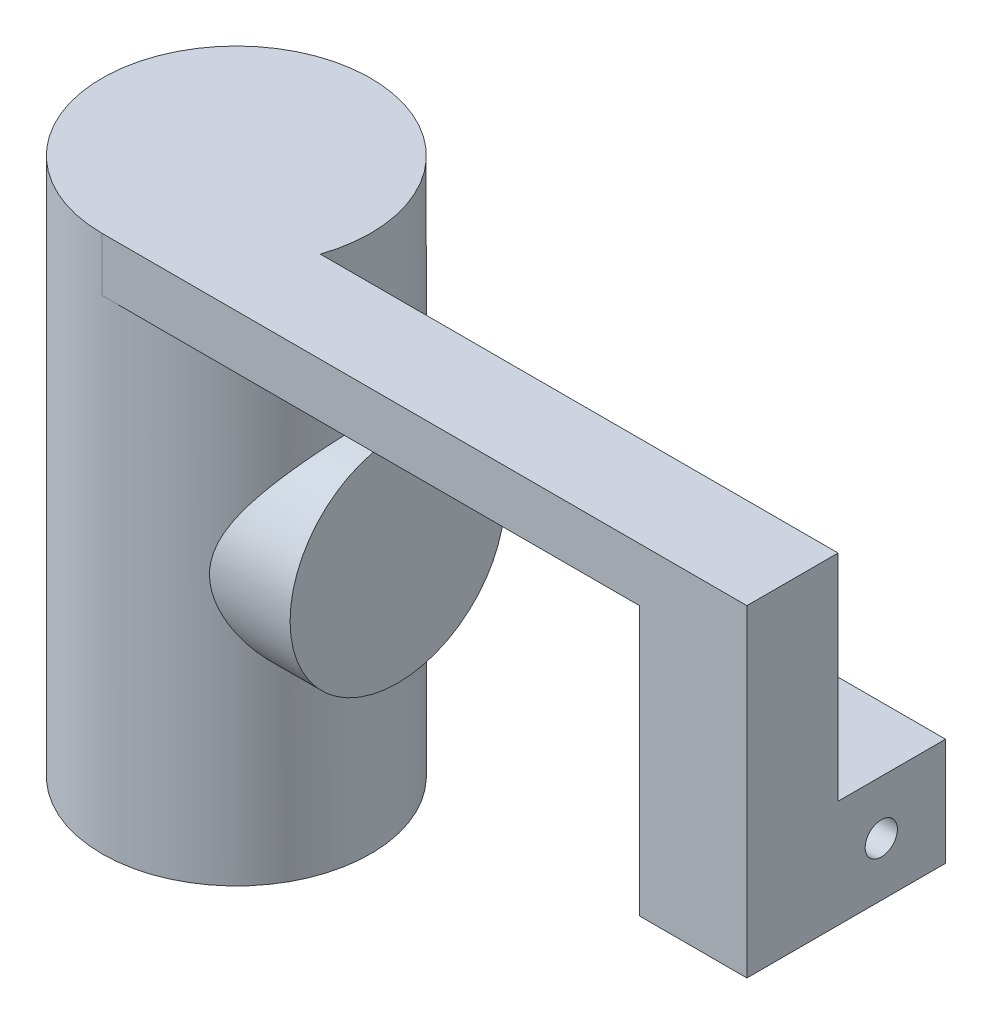
ISO-10303-21;
HEADER;
FILE_DESCRIPTION(('STEP AP214'),'2;1');
FILE_NAME('part.step','',(''),(''),'','','');
FILE_SCHEMA(('AUTOMOTIVE_DESIGN { 1 0 10303 214 1 1 1 1 }'));
ENDSEC;
DATA;
#1=APPLICATION_CONTEXT('core data for automotive mechanical design processes');
#2=APPLICATION_PROTOCOL_DEFINITION('international standard','automotive_design',2000,#1);
#3=PRODUCT_CONTEXT('',#1,'mechanical');
#4=PRODUCT('Part','Part','',(#3));
#5=PRODUCT_RELATED_PRODUCT_CATEGORY('part','',(#4));
#6=PRODUCT_DEFINITION_FORMATION('','',#4);
#7=PRODUCT_DEFINITION_CONTEXT('part definition',#1,'design');
#8=PRODUCT_DEFINITION('design','',#6,#7);
#9=PRODUCT_DEFINITION_SHAPE('','',#8);
#10=(LENGTH_UNIT() NAMED_UNIT(*) SI_UNIT(.MILLI.,.METRE.));
#11=(NAMED_UNIT(*) PLANE_ANGLE_UNIT() SI_UNIT($,.RADIAN.));
#12=(NAMED_UNIT(*) SI_UNIT($,.STERADIAN.) SOLID_ANGLE_UNIT());
#13=UNCERTAINTY_MEASURE_WITH_UNIT(LENGTH_MEASURE(1.E-05),#10,'distance_accuracy_value','');
#14=(GEOMETRIC_REPRESENTATION_CONTEXT(3) GLOBAL_UNCERTAINTY_ASSIGNED_CONTEXT((#13)) GLOBAL_UNIT_ASSIGNED_CONTEXT((#10,
#11,#12)) REPRESENTATION_CONTEXT('',''));
#15=CARTESIAN_POINT('',(0.,0.,0.));
#16=DIRECTION('',(0.,0.,1.));
#17=DIRECTION('',(1.,0.,0.));
#18=AXIS2_PLACEMENT_3D('',#15,#16,#17);
#19=CARTESIAN_POINT('',(229.689354239155,50.,8.039142994679));
#20=DIRECTION('',(0.,0.,1.));
#21=DIRECTION('',(0.,-1.,0.));
#22=AXIS2_PLACEMENT_3D('',#19,#20,#21);
#23=PLANE('',#22);
#24=DIRECTION('',(1.,0.,0.));
#25=VECTOR('',#24,1.);
#26=CARTESIAN_POINT('',(100.,10.,8.039142994679));
#27=LINE('',#26,#25);
#28=CARTESIAN_POINT('',(100.,10.,8.039142994679));
#29=VERTEX_POINT('',#28);
#30=CARTESIAN_POINT('',(120.,10.,8.039142994679));
#31=VERTEX_POINT('',#30);
#32=EDGE_CURVE('E130',#29,#31,#27,.T.);
#33=ORIENTED_EDGE('',*,*,#32,.F.);
#34=DIRECTION('',(0.,1.,0.));
#35=VECTOR('',#34,1.);
#36=CARTESIAN_POINT('',(100.,-10.,8.039142994679));
#37=LINE('',#36,#35);
#38=CARTESIAN_POINT('',(100.,40.,8.039142994679));
#39=VERTEX_POINT('',#38);
#40=EDGE_CURVE('E135',#29,#39,#37,.T.);
#41=ORIENTED_EDGE('',*,*,#40,.T.);
#42=DIRECTION('',(-1.,0.,0.));
#43=VECTOR('',#42,1.);
#44=CARTESIAN_POINT('',(229.689354239155,40.,8.039142994679));
#45=LINE('',#44,#43);
#46=CARTESIAN_POINT('',(23.6721815621439,40.,8.039142994679));
#47=VERTEX_POINT('',#46);
#48=EDGE_CURVE('E58',#39,#47,#45,.T.);
#49=ORIENTED_EDGE('',*,*,#48,.T.);
#50=DIRECTION('',(0.,-1.,0.));
#51=VECTOR('',#50,1.);
#52=CARTESIAN_POINT('',(23.6721815621439,50.,8.039142994679));
#53=LINE('',#52,#51);
#54=CARTESIAN_POINT('',(23.6721815621439,50.,8.039142994679));
#55=VERTEX_POINT('',#54);
#56=EDGE_CURVE('E169',#47,#55,#53,.F.);
#57=ORIENTED_EDGE('',*,*,#56,.T.);
#58=DIRECTION('',(-1.,0.,0.));
#59=VECTOR('',#58,1.);
#60=CARTESIAN_POINT('',(229.689354239155,50.,8.039142994679));
#61=LINE('',#60,#59);
#62=CARTESIAN_POINT('',(120.,50.,8.039142994679));
#63=VERTEX_POINT('',#62);
#64=EDGE_CURVE('E177',#63,#55,#61,.T.);
#65=ORIENTED_EDGE('',*,*,#64,.F.);
#66=DIRECTION('',(0.,1.,0.));
#67=VECTOR('',#66,1.);
#68=CARTESIAN_POINT('',(120.,50.,8.039142994679));
#69=LINE('',#68,#67);
#70=EDGE_CURVE('E166',#31,#63,#69,.T.);
#71=ORIENTED_EDGE('',*,*,#70,.F.);
#72=EDGE_LOOP('',(#33,#41,#49,#57,#65,#71));
#73=FACE_BOUND('',#72,.T.);
#74=ADVANCED_FACE('F41',(#73),#23,.F.);
#75=CARTESIAN_POINT('',(229.689354239155,40.,25.));
#76=DIRECTION('',(0.,1.,0.));
#77=DIRECTION('',(0.,0.,1.));
#78=AXIS2_PLACEMENT_3D('',#75,#76,#77);
#79=PLANE('',#78);
#80=DIRECTION('',(0.,0.,-1.));
#81=VECTOR('',#80,1.);
#82=CARTESIAN_POINT('',(100.,40.,25.));
#83=LINE('',#82,#81);
#84=CARTESIAN_POINT('',(100.,40.,25.));
#85=VERTEX_POINT('',#84);
#86=EDGE_CURVE('E137',#85,#39,#83,.T.);
#87=ORIENTED_EDGE('',*,*,#86,.F.);
#88=DIRECTION('',(-1.,0.,0.));
#89=VECTOR('',#88,1.);
#90=CARTESIAN_POINT('',(229.689354239155,40.,25.));
#91=LINE('',#90,#89);
#92=CARTESIAN_POINT('',(0.,40.,25.));
#93=VERTEX_POINT('',#92);
#94=EDGE_CURVE('E165',#85,#93,#91,.T.);
#95=ORIENTED_EDGE('',*,*,#94,.T.);
#96=CARTESIAN_POINT('',(0.,40.,0.));
#97=DIRECTION('',(0.,1.,0.));
#98=DIRECTION('',(0.,0.,1.));
#99=AXIS2_PLACEMENT_3D('',#96,#97,#98);
#100=CIRCLE('',#99,25.);
#101=EDGE_CURVE('E12',#93,#47,#100,.T.);
#102=ORIENTED_EDGE('',*,*,#101,.T.);
#103=ORIENTED_EDGE('',*,*,#48,.F.);
#104=EDGE_LOOP('',(#87,#95,#102,#103));
#105=FACE_BOUND('',#104,.T.);
#106=ADVANCED_FACE('F223',(#105),#79,.F.);
#107=CARTESIAN_POINT('',(0.,50.,0.));
#108=DIRECTION('',(0.,-1.,0.));
#109=DIRECTION('',(0.,0.,-1.));
#110=AXIS2_PLACEMENT_3D('',#107,#108,#109);
#111=CYLINDRICAL_SURFACE('',#110,25.);
#112=CARTESIAN_POINT('',(15.,0.,20.));
#113=CARTESIAN_POINT('',(15.0000088736725,-0.375561365561585,19.9999962926173));
#114=CARTESIAN_POINT('',(15.0141750346591,-0.751259573291653,19.9893930046637));
#115=CARTESIAN_POINT('',(15.070142772738,-1.49955766359186,19.9472295614098));
#116=CARTESIAN_POINT('',(15.1119631943118,-1.87215525787202,19.9156551156393));
#117=CARTESIAN_POINT('',(15.2213478980294,-2.61223578611677,19.8321780083143));
#118=CARTESIAN_POINT('',(15.2889813033108,-2.97970221671656,19.7802207542779));
#119=CARTESIAN_POINT('',(15.4470727059971,-3.70647875847824,19.6570076475307));
#120=CARTESIAN_POINT('',(15.5375387662973,-4.06578593940734,19.5857449768447));
#121=CARTESIAN_POINT('',(15.7052830755086,-4.65924234796872,19.4512611935685));
#122=CARTESIAN_POINT('',(15.777264008289,-4.89604979318361,19.3929770863774));
#123=CARTESIAN_POINT('',(15.9290175269818,-5.36495838353939,19.2685245813802));
#124=CARTESIAN_POINT('',(16.008787864795,-5.59706086336365,19.2023584571969));
#125=CARTESIAN_POINT('',(16.2583874663851,-6.28639950755564,18.9924204482248));
#126=CARTESIAN_POINT('',(16.438461109604,-6.7365147814177,18.837243748835));
#127=CARTESIAN_POINT('',(16.8189383053475,-7.61808786661511,18.4983342499176));
#128=CARTESIAN_POINT('',(17.0193868879852,-8.04950120855747,18.3145377001011));
#129=CARTESIAN_POINT('',(17.4341293267654,-8.89289471182062,17.9201862603243));
#130=CARTESIAN_POINT('',(17.6484228314515,-9.30487536598581,17.7096320494823));
#131=CARTESIAN_POINT('',(18.1648305832741,-10.2553974120961,17.1819650319468));
#132=CARTESIAN_POINT('',(18.4706788691686,-10.7858294871581,16.8538529821223));
#133=CARTESIAN_POINT('',(19.0880028760279,-11.8118379642277,16.1513803264203));
#134=CARTESIAN_POINT('',(19.3994805823717,-12.3074017550521,15.7770031209023));
#135=CARTESIAN_POINT('',(20.0190040941794,-13.2624424849901,14.9830857260937));
#136=CARTESIAN_POINT('',(20.327052455025,-13.7219480872222,14.5635820504617));
#137=CARTESIAN_POINT('',(20.9321249221037,-14.6033006830766,13.6796522230808));
#138=CARTESIAN_POINT('',(21.2291526745127,-15.025160198026,13.2152411157172));
#139=CARTESIAN_POINT('',(21.748027106478,-15.7488727978038,12.3381233033674));
#140=CARTESIAN_POINT('',(21.9731384202275,-16.0579745515095,11.9333126892403));
#141=CARTESIAN_POINT('',(22.4078243876689,-16.6478331858641,11.0955852490369));
#142=CARTESIAN_POINT('',(22.6173997412604,-16.9285913436069,10.6626696907469));
#143=CARTESIAN_POINT('',(23.0169572465042,-17.4588269628689,9.77028072461787));
#144=CARTESIAN_POINT('',(23.2069637984017,-17.708343465351,9.310841533003));
#145=CARTESIAN_POINT('',(23.5638648098979,-18.1735518121657,8.36653359290353));
#146=CARTESIAN_POINT('',(23.7307631030067,-18.3892492676466,7.88166908075929));
#147=CARTESIAN_POINT('',(24.0129006885665,-18.7518040690791,6.96924325820464));
#148=CARTESIAN_POINT('',(24.132129407249,-18.9041530577568,6.54509212186977));
#149=CARTESIAN_POINT('',(24.3496617753786,-19.1810681740325,5.68257829158782));
#150=CARTESIAN_POINT('',(24.4479675644109,-19.305637142486,5.24421705605759));
#151=CARTESIAN_POINT('',(24.6217593056216,-19.5252538478018,4.3558821644556));
#152=CARTESIAN_POINT('',(24.697253945882,-19.6203128245134,3.90591300054797));
#153=CARTESIAN_POINT('',(24.8239328453673,-19.7795341449066,2.99713406477301));
#154=CARTESIAN_POINT('',(24.875116814311,-19.8436961196631,2.53832418741135));
#155=CARTESIAN_POINT('',(24.9521996672002,-19.9402386753894,1.61360726200759));
#156=CARTESIAN_POINT('',(24.9780091489872,-19.9725068868928,1.1476809523183));
#157=CARTESIAN_POINT('',(25.0034458784075,-20.0043094777888,0.213992042391241));
#158=CARTESIAN_POINT('',(25.0030730756769,-20.0038437942145,-0.253770561377071));
#159=CARTESIAN_POINT('',(24.9761538060095,-19.9701867716747,-1.18736799204042));
#160=CARTESIAN_POINT('',(24.9496064528335,-19.9369943246195,-1.65320275312468));
#161=CARTESIAN_POINT('',(24.8709347186019,-19.8384544172188,-2.57925249006266));
#162=CARTESIAN_POINT('',(24.8188109274667,-19.7731076985111,-3.03946759528277));
#163=CARTESIAN_POINT('',(24.6936449338048,-19.6157650157554,-3.92597136214756));
#164=CARTESIAN_POINT('',(24.6219015200442,-19.5254205018148,-4.35273966221057));
#165=CARTESIAN_POINT('',(24.4579006470034,-19.3182016356292,-5.19571671792422));
#166=CARTESIAN_POINT('',(24.3656441088654,-19.2013284746489,-5.61192594679553));
#167=CARTESIAN_POINT('',(24.1621838322245,-18.9424794722292,-6.43174107520527));
#168=CARTESIAN_POINT('',(24.0509776242432,-18.8005003589476,-6.83534532396913));
#169=CARTESIAN_POINT('',(23.8113816719206,-18.4930035981065,-7.62821449404832));
#170=CARTESIAN_POINT('',(23.6829909080916,-18.3274845539852,-8.01747856287235));
#171=CARTESIAN_POINT('',(23.3977812813461,-17.9574879426194,-8.81708135492414));
#172=CARTESIAN_POINT('',(23.2394155993336,-17.7507939301222,-9.22584184459561));
#173=CARTESIAN_POINT('',(22.906772368539,-17.3130145334012,-10.0232967345393));
#174=CARTESIAN_POINT('',(22.7324939744453,-17.0819278532935,-10.4119900670894));
#175=CARTESIAN_POINT('',(22.3704779605334,-16.5971172246319,-11.1686012750122));
#176=CARTESIAN_POINT('',(22.1827357392803,-16.3433855295415,-11.5365119701174));
#177=CARTESIAN_POINT('',(21.7963253746775,-15.8149386877666,-12.2509255452122));
#178=CARTESIAN_POINT('',(21.5976557576735,-15.5402207089469,-12.5974255243352));
#179=CARTESIAN_POINT('',(21.1500639982279,-14.9125174759115,-13.3378586904546));
#180=CARTESIAN_POINT('',(20.8992219334084,-14.5550685913468,-13.7268549610686));
#181=CARTESIAN_POINT('',(20.3896591476269,-13.8134297991933,-14.4729375752678));
#182=CARTESIAN_POINT('',(20.1309371335264,-13.4292354891031,-14.8300186431678));
#183=CARTESIAN_POINT('',(19.6099503005857,-12.6348803465673,-15.5123917113823));
#184=CARTESIAN_POINT('',(19.3476817054736,-12.2246897841468,-15.8376461922545));
#185=CARTESIAN_POINT('',(18.8249798408101,-11.3793795574921,-16.4555095922113));
#186=CARTESIAN_POINT('',(18.5645463549802,-10.9442628880631,-16.7481224207045));
#187=CARTESIAN_POINT('',(18.0760476169757,-10.0922382908298,-17.2734617260135));
#188=CARTESIAN_POINT('',(17.8472812713524,-9.67761490271183,-17.5092418134772));
#189=CARTESIAN_POINT('',(17.4010467415081,-8.82764455668295,-17.9527853755262));
#190=CARTESIAN_POINT('',(17.1835798514243,-8.39229523590542,-18.1605456453044));
#191=CARTESIAN_POINT('',(16.766490943437,-7.50132950291147,-18.5463023979791));
#192=CARTESIAN_POINT('',(16.5668389427307,-7.04574915271813,-18.7243493460744));
#193=CARTESIAN_POINT('',(16.1924320055337,-6.11365179288613,-19.0490562055205));
#194=CARTESIAN_POINT('',(16.0176656946503,-5.63714447939481,-19.1957304717373));
#195=CARTESIAN_POINT('',(15.7494779227909,-4.81134027770838,-19.4158267954433));
#196=CARTESIAN_POINT('',(15.6474408209615,-4.46715880626483,-19.4979866901541));
#197=CARTESIAN_POINT('',(15.4628513048279,-3.7699691020778,-19.644697477778));
#198=CARTESIAN_POINT('',(15.3802925740366,-3.41696377193502,-19.7092540801845));
#199=CARTESIAN_POINT('',(15.2378089632064,-2.70415887126981,-19.8196196469868));
#200=CARTESIAN_POINT('',(15.1778430449527,-2.34437287828416,-19.8654626161209));
#201=CARTESIAN_POINT('',(15.0829006253516,-1.61954026555112,-19.9376452096634));
#202=CARTESIAN_POINT('',(15.0479235746009,-1.25449376164095,-19.9639852628618));
#203=CARTESIAN_POINT('',(15.004495765486,-0.519741930356911,-19.9966465151378));
#204=CARTESIAN_POINT('',(14.9962026395826,-0.150021824373883,-20.0028487541605));
#205=CARTESIAN_POINT('',(15.0070056423833,0.588778260838356,-19.9947448333189));
#206=CARTESIAN_POINT('',(15.0261013335287,0.957858250199638,-19.9804390010878));
#207=CARTESIAN_POINT('',(15.0907673124735,1.69276004301759,-19.9316421636585));
#208=CARTESIAN_POINT('',(15.1363693313635,2.05857740688934,-19.897126965185));
#209=CARTESIAN_POINT('',(15.2519500086948,2.78393767436353,-19.8086666638765));
#210=CARTESIAN_POINT('',(15.3219324158413,3.14347960412859,-19.7547185730151));
#211=CARTESIAN_POINT('',(15.5039537824714,3.94474949867919,-19.6123414444282));
#212=CARTESIAN_POINT('',(15.6221613393066,4.38413764893602,-19.5186334357215));
#213=CARTESIAN_POINT('',(15.8861506870295,5.24777425459926,-19.30437872468));
#214=CARTESIAN_POINT('',(16.0319410795805,5.67201793803901,-19.1838236480477));
#215=CARTESIAN_POINT('',(16.3453571903969,6.5053974046704,-18.9174959721956));
#216=CARTESIAN_POINT('',(16.5130356193875,6.91449355432119,-18.7716622095721));
#217=CARTESIAN_POINT('',(16.8645052787844,7.71630397644958,-18.4565497219518));
#218=CARTESIAN_POINT('',(17.0482972342497,8.10901751058542,-18.2872699417578));
#219=CARTESIAN_POINT('',(17.5141378978346,9.05448174997462,-17.8437728166938));
#220=CARTESIAN_POINT('',(17.8026475925749,9.59818744606174,-17.5569940558555));
#221=CARTESIAN_POINT('',(18.3923133044943,10.6521259877462,-16.9382926641353));
#222=CARTESIAN_POINT('',(18.6934744791287,11.1623449607814,-16.6063514966159));
#223=CARTESIAN_POINT('',(19.2993500057982,12.14977017796,-15.8981910771778));
#224=CARTESIAN_POINT('',(19.604067568823,12.6269433715611,-15.5219284847033));
#225=CARTESIAN_POINT('',(20.2087648819092,13.5467385964473,-14.7260197475678));
#226=CARTESIAN_POINT('',(20.5087453654267,13.9893660192377,-14.3063803965086));
#227=CARTESIAN_POINT('',(21.1010814398247,14.8442550460794,-13.4176591751879));
#228=CARTESIAN_POINT('',(21.3932659754237,15.2559901109569,-12.9479545282489));
#229=CARTESIAN_POINT('',(21.9582997842282,16.0387099798112,-11.96472790954));
#230=CARTESIAN_POINT('',(22.2311460291023,16.4096884063743,-11.451199102638));
#231=CARTESIAN_POINT('',(22.7496340984626,17.1055406908179,-10.3829352665371));
#232=CARTESIAN_POINT('',(22.9953486137735,17.4305384314257,-9.82831733877888));
#233=CARTESIAN_POINT('',(23.3385721876208,17.8801076354938,-8.96697709545808));
#234=CARTESIAN_POINT('',(23.448740173778,18.0236234193895,-8.67500917496761));
#235=CARTESIAN_POINT('',(23.6598323896979,18.2974119316906,-8.08155345049274));
#236=CARTESIAN_POINT('',(23.7607544783473,18.4276815933968,-7.78006346306885));
#237=CARTESIAN_POINT('',(23.9864150237953,18.7178828454875,-7.05977052154347));
#238=CARTESIAN_POINT('',(24.1069206872683,18.8719680361833,-6.63725388225576));
#239=CARTESIAN_POINT('',(24.3271756451156,19.1525199621413,-5.77799128175702));
#240=CARTESIAN_POINT('',(24.426930345177,19.2789938906448,-5.34124906072598));
#241=CARTESIAN_POINT('',(24.6038051925525,19.5026129269895,-4.45604509629661));
#242=CARTESIAN_POINT('',(24.6809373236533,19.5997735636586,-4.00758969530503));
#243=CARTESIAN_POINT('',(24.8110733743243,19.7633960613692,-3.10162102535077));
#244=CARTESIAN_POINT('',(24.8640764361472,19.8298568310838,-2.64410743498803));
#245=CARTESIAN_POINT('',(24.9449604563783,19.9311813368763,-1.72165098455351));
#246=CARTESIAN_POINT('',(24.9727480071601,19.9659275933639,-1.25668694235152));
#247=CARTESIAN_POINT('',(25.0022398851849,20.0028028698372,-0.324636920765033));
#248=CARTESIAN_POINT('',(25.0039443159793,20.0049320193146,0.14244905018793));
#249=CARTESIAN_POINT('',(24.9812313594413,19.9765360289776,1.07501253628732));
#250=CARTESIAN_POINT('',(24.9568122993052,19.9460087980292,1.54048994651549));
#251=CARTESIAN_POINT('',(24.8823991138229,19.852822771282,2.46613028976822));
#252=CARTESIAN_POINT('',(24.8324055484018,19.7901646789523,2.92629333891921));
#253=CARTESIAN_POINT('',(24.7112783596282,19.6379550163403,3.81343860295224));
#254=CARTESIAN_POINT('',(24.6414224290542,19.5500261634115,4.2408766972769));
#255=CARTESIAN_POINT('',(24.4810822615916,19.3475376045485,5.08540514048392));
#256=CARTESIAN_POINT('',(24.3905989317902,19.2329790696467,5.50249594349304));
#257=CARTESIAN_POINT('',(24.1905493315002,18.9786417620177,6.32425481235322));
#258=CARTESIAN_POINT('',(24.0809804312658,18.8388595136921,6.72892115722401));
#259=CARTESIAN_POINT('',(23.8445097564192,18.5356319173577,7.52405713766176));
#260=CARTESIAN_POINT('',(23.7176069710047,18.3721851893531,7.91452594363564));
#261=CARTESIAN_POINT('',(23.435792971905,18.0069741535771,8.71551599708837));
#262=CARTESIAN_POINT('',(23.2793746325239,17.8030600981142,9.12452586284841));
#263=CARTESIAN_POINT('',(22.9505208202088,17.3708397932964,9.92269877577447));
#264=CARTESIAN_POINT('',(22.7780845268679,17.1425322944691,10.3118608047917));
#265=CARTESIAN_POINT('',(22.4196291139931,16.6632855241318,11.0695956858229));
#266=CARTESIAN_POINT('',(22.2336057355117,16.4123391504941,11.4381620175476));
#267=CARTESIAN_POINT('',(21.8504812379481,15.8894676764289,12.1540671210363));
#268=CARTESIAN_POINT('',(21.6533786207584,15.6175397370637,12.5014030087528));
#269=CARTESIAN_POINT('',(21.2093319256466,14.9964049343675,13.2433919812304));
#270=CARTESIAN_POINT('',(20.9604424512646,14.6427713706468,13.6331825209505));
#271=CARTESIAN_POINT('',(20.4544911079644,13.908878699446,14.3811580620588));
#272=CARTESIAN_POINT('',(20.1974279286196,13.5286153107423,14.7393379604498));
#273=CARTESIAN_POINT('',(19.6793744983526,12.7422691821517,15.4242266229859));
#274=CARTESIAN_POINT('',(19.4183799698283,12.3361564929569,15.750897736964));
#275=CARTESIAN_POINT('',(18.8977264748114,11.4991956764628,16.3719288348251));
#276=CARTESIAN_POINT('',(18.6380673636508,11.0683502927338,16.6662923920412));
#277=CARTESIAN_POINT('',(18.1464213371624,10.2177829386944,17.1996539797735));
#278=CARTESIAN_POINT('',(17.9138936542805,9.79997472394165,17.4412037102238));
#279=CARTESIAN_POINT('',(17.4598987877254,8.94316246516532,17.8956723308303));
#280=CARTESIAN_POINT('',(17.2384330856758,8.50415559723356,18.1085873921353));
#281=CARTESIAN_POINT('',(16.8131298776554,7.60512559780488,18.5041297985685));
#282=CARTESIAN_POINT('',(16.6092684112044,7.14513237707597,18.6867986318384));
#283=CARTESIAN_POINT('',(16.3222934934104,6.43920528015332,18.9367073332312));
#284=CARTESIAN_POINT('',(16.2297866385868,6.20128511992555,19.0159821477095));
#285=CARTESIAN_POINT('',(16.0520749254619,5.72006488967305,19.1662311715375));
#286=CARTESIAN_POINT('',(15.9668719304727,5.47676346661397,19.2372032644263));
#287=CARTESIAN_POINT('',(15.7719192862284,4.88469439361789,19.3976380854507));
#288=CARTESIAN_POINT('',(15.6663258187387,4.53337259601621,19.4828412250051));
#289=CARTESIAN_POINT('',(15.4753395886442,3.82146578549283,19.6348871812494));
#290=CARTESIAN_POINT('',(15.3899397410734,3.46088407079989,19.7017364387605));
#291=CARTESIAN_POINT('',(15.2427899112173,2.73299414839423,19.8158023757433));
#292=CARTESIAN_POINT('',(15.1809684476404,2.36570986624404,19.8630784321024));
#293=CARTESIAN_POINT('',(15.0834023040712,1.62579828749899,19.9372716028599));
#294=CARTESIAN_POINT('',(15.047639365899,1.25317491880971,19.9642029724643));
#295=CARTESIAN_POINT('',(15.0171901387789,0.733091557313932,19.9870977278165));
#296=CARTESIAN_POINT('',(15.0107508892615,0.586606371828128,19.9919330770175));
#297=CARTESIAN_POINT('',(15.0021538078059,0.29342110302062,19.9983851468271));
#298=CARTESIAN_POINT('',(14.9999965333121,0.146720994206791,20.0000014483675));
#299=CARTESIAN_POINT('',(15.,0.,20.));
#300=B_SPLINE_CURVE_WITH_KNOTS('',3,(#112,#113,#114,#115,#116,#117,#118,#119,#120,#121,#122,
#123,#124,#125,#126,#127,#128,#129,#130,#131,#132,#133,#134,#135,#136,#137,#138,#139,#140,#141,
#142,#143,#144,#145,#146,#147,#148,#149,#150,#151,#152,#153,#154,#155,#156,#157,#158,#159,#160,
#161,#162,#163,#164,#165,#166,#167,#168,#169,#170,#171,#172,#173,#174,#175,#176,#177,#178,#179,
#180,#181,#182,#183,#184,#185,#186,#187,#188,#189,#190,#191,#192,#193,#194,#195,#196,#197,#198,
#199,#200,#201,#202,#203,#204,#205,#206,#207,#208,#209,#210,#211,#212,#213,#214,#215,#216,#217,
#218,#219,#220,#221,#222,#223,#224,#225,#226,#227,#228,#229,#230,#231,#232,#233,#234,#235,#236,
#237,#238,#239,#240,#241,#242,#243,#244,#245,#246,#247,#248,#249,#250,#251,#252,#253,#254,#255,
#256,#257,#258,#259,#260,#261,#262,#263,#264,#265,#266,#267,#268,#269,#270,#271,#272,#273,#274,
#275,#276,#277,#278,#279,#280,#281,#282,#283,#284,#285,#286,#287,#288,#289,#290,#291,#292,#293,
#294,#295,#296,#297,#298,#299),.UNSPECIFIED.,.T.,.F.,(4,2,2,2,2,2,2,2,2,2,2,2,2,2,2,2,2,2,2,2,2,
2,2,2,2,2,2,2,2,2,2,2,2,2,2,2,2,2,2,2,2,2,2,2,2,2,2,2,2,2,2,2,2,2,2,2,2,2,2,2,2,2,2,2,2,2,2,2,2,
2,2,2,2,2,2,2,2,2,2,2,2,2,2,2,2,2,2,2,2,2,2,2,2,4),(0.,1.12651574952473,2.2537999344042,
3.3841242341917,4.51484824523439,5.27739675794963,6.03972583845545,7.56486868792285,
9.09345869330433,10.6220099103027,12.7033327859322,14.7854046068517,16.8658042338039,
18.9455093073508,20.6145867164359,22.2835888873329,23.9504841293649,25.617102512125,
27.0142554580865,28.4112654620493,29.8077427141851,31.2042366405157,32.6056333996718,
34.0070328545445,35.4084797607792,36.8098943441777,38.1347256488484,39.4594974739462,
40.7844420725439,42.1094653094182,43.5620343914882,45.0146806815627,46.4678258200048,
47.921167410504,49.6739596258463,51.4270410495421,53.1821648420752,54.9370782016407,
56.5229157235616,58.1089344743811,59.6922314901944,61.2748024964205,62.3787128562362,
63.4822647441278,64.5838023331136,65.6853157030333,66.7933243129855,67.9013152217966,
69.0106352615765,70.1201259446855,71.5116354138465,72.9035795404123,74.2989398143853,
75.6943629075203,77.7286442161459,79.7637630163798,81.8008886805686,83.8376957752715,
85.9037141544938,87.9700553558267,90.0307187759073,91.0607299822863,92.0909791131436,
93.4862959450826,94.8812488364182,96.2754614433078,97.6697236082186,99.0691298009904,
100.468530438043,101.868020690334,103.267480303666,104.591878389361,105.916218246054,
107.240740724274,108.565340473252,110.013105171573,111.460944062375,112.909238750287,
114.357729746375,116.102639440861,117.847830307862,119.595081337061,121.342138918783,
122.948043417708,124.554162435227,126.158059786143,126.959714545967,127.761573213736,
128.890375919398,130.018781993105,131.143739420532,132.267907874765,132.707947806639,
133.148045020879),.UNSPECIFIED.);
#301=CARTESIAN_POINT('',(15.,0.,20.));
#302=VERTEX_POINT('',#301);
#303=EDGE_CURVE('E51',#302,#302,#300,.T.);
#304=ORIENTED_EDGE('',*,*,#303,.F.);
#305=EDGE_LOOP('',(#304));
#306=FACE_BOUND('',#305,.T.);
#307=CARTESIAN_POINT('',(0.,-50.,0.));
#308=DIRECTION('',(0.,1.,0.));
#309=DIRECTION('',(0.,0.,1.));
#310=AXIS2_PLACEMENT_3D('',#307,#308,#309);
#311=CIRCLE('',#310,25.);
#312=CARTESIAN_POINT('',(0.,-50.,25.));
#313=VERTEX_POINT('',#312);
#314=EDGE_CURVE('E194',#313,#313,#311,.T.);
#315=ORIENTED_EDGE('',*,*,#314,.T.);
#316=EDGE_LOOP('',(#315));
#317=FACE_BOUND('',#316,.T.);
#318=ORIENTED_EDGE('',*,*,#56,.F.);
#319=ORIENTED_EDGE('',*,*,#101,.F.);
#320=DIRECTION('',(0.,-1.,0.));
#321=VECTOR('',#320,1.);
#322=CARTESIAN_POINT('',(0.,50.,25.));
#323=LINE('',#322,#321);
#324=CARTESIAN_POINT('',(0.,50.,25.));
#325=VERTEX_POINT('',#324);
#326=EDGE_CURVE('E161',#325,#93,#323,.T.);
#327=ORIENTED_EDGE('',*,*,#326,.F.);
#328=CARTESIAN_POINT('',(0.,50.,0.));
#329=DIRECTION('',(0.,1.,0.));
#330=DIRECTION('',(0.,0.,1.));
#331=AXIS2_PLACEMENT_3D('',#328,#329,#330);
#332=CIRCLE('',#331,25.);
#333=EDGE_CURVE('E65',#55,#325,#332,.T.);
#334=ORIENTED_EDGE('',*,*,#333,.F.);
#335=EDGE_LOOP('',(#318,#319,#327,#334));
#336=FACE_BOUND('',#335,.T.);
#337=ADVANCED_FACE('F43',(#306,#317,#336),#111,.T.);
#338=CARTESIAN_POINT('',(0.,50.,0.));
#339=DIRECTION('',(0.,1.,0.));
#340=DIRECTION('',(0.,0.,1.));
#341=AXIS2_PLACEMENT_3D('',#338,#339,#340);
#342=PLANE('',#341);
#343=ORIENTED_EDGE('',*,*,#333,.T.);
#344=DIRECTION('',(-1.,0.,0.));
#345=VECTOR('',#344,1.);
#346=CARTESIAN_POINT('',(229.689354239155,50.,25.));
#347=LINE('',#346,#345);
#348=CARTESIAN_POINT('',(120.,50.,25.));
#349=VERTEX_POINT('',#348);
#350=EDGE_CURVE('E160',#349,#325,#347,.T.);
#351=ORIENTED_EDGE('',*,*,#350,.F.);
#352=DIRECTION('',(0.,0.,1.));
#353=VECTOR('',#352,1.);
#354=CARTESIAN_POINT('',(120.,50.,25.));
#355=LINE('',#354,#353);
#356=EDGE_CURVE('E173',#63,#349,#355,.T.);
#357=ORIENTED_EDGE('',*,*,#356,.F.);
#358=ORIENTED_EDGE('',*,*,#64,.T.);
#359=EDGE_LOOP('',(#343,#351,#357,#358));
#360=FACE_BOUND('',#359,.T.);
#361=ADVANCED_FACE('F214',(#360),#342,.T.);
#362=CARTESIAN_POINT('',(0.,-50.,0.));
#363=DIRECTION('',(0.,1.,0.));
#364=DIRECTION('',(0.,0.,1.));
#365=AXIS2_PLACEMENT_3D('',#362,#363,#364);
#366=PLANE('',#365);
#367=ORIENTED_EDGE('',*,*,#314,.F.);
#368=EDGE_LOOP('',(#367));
#369=FACE_BOUND('',#368,.T.);
#370=ADVANCED_FACE('F211',(#369),#366,.F.);
#371=CARTESIAN_POINT('',(30.,0.,0.));
#372=DIRECTION('',(-1.,0.,0.));
#373=DIRECTION('',(0.,0.,1.));
#374=AXIS2_PLACEMENT_3D('',#371,#372,#373);
#375=CYLINDRICAL_SURFACE('',#374,20.);
#376=CARTESIAN_POINT('',(30.,0.,0.));
#377=DIRECTION('',(1.,0.,0.));
#378=DIRECTION('',(0.,0.,-1.));
#379=AXIS2_PLACEMENT_3D('',#376,#377,#378);
#380=CIRCLE('',#379,20.);
#381=CARTESIAN_POINT('',(30.,0.,-20.));
#382=VERTEX_POINT('',#381);
#383=EDGE_CURVE('E190',#382,#382,#380,.T.);
#384=ORIENTED_EDGE('',*,*,#383,.F.);
#385=EDGE_LOOP('',(#384));
#386=FACE_BOUND('',#385,.T.);
#387=ORIENTED_EDGE('',*,*,#303,.T.);
#388=EDGE_LOOP('',(#387));
#389=FACE_BOUND('',#388,.T.);
#390=ADVANCED_FACE('F205',(#386,#389),#375,.T.);
#391=CARTESIAN_POINT('',(30.,0.,0.));
#392=DIRECTION('',(1.,0.,0.));
#393=DIRECTION('',(0.,0.,-1.));
#394=AXIS2_PLACEMENT_3D('',#391,#392,#393);
#395=PLANE('',#394);
#396=ORIENTED_EDGE('',*,*,#383,.T.);
#397=EDGE_LOOP('',(#396));
#398=FACE_BOUND('',#397,.T.);
#399=ADVANCED_FACE('F210',(#398),#395,.T.);
#400=CARTESIAN_POINT('',(229.689354239155,50.,25.));
#401=DIRECTION('',(0.,0.,-1.));
#402=DIRECTION('',(-1.,0.,0.));
#403=AXIS2_PLACEMENT_3D('',#400,#401,#402);
#404=PLANE('',#403);
#405=DIRECTION('',(0.,-1.,0.));
#406=VECTOR('',#405,1.);
#407=CARTESIAN_POINT('',(120.,50.,25.));
#408=LINE('',#407,#406);
#409=CARTESIAN_POINT('',(120.,-10.,25.));
#410=VERTEX_POINT('',#409);
#411=EDGE_CURVE('E170',#349,#410,#408,.T.);
#412=ORIENTED_EDGE('',*,*,#411,.F.);
#413=ORIENTED_EDGE('',*,*,#350,.T.);
#414=ORIENTED_EDGE('',*,*,#326,.T.);
#415=ORIENTED_EDGE('',*,*,#94,.F.);
#416=DIRECTION('',(0.,1.,0.));
#417=VECTOR('',#416,1.);
#418=CARTESIAN_POINT('',(100.,-10.,25.));
#419=LINE('',#418,#417);
#420=CARTESIAN_POINT('',(100.,-10.,25.));
#421=VERTEX_POINT('',#420);
#422=EDGE_CURVE('E157',#421,#85,#419,.T.);
#423=ORIENTED_EDGE('',*,*,#422,.F.);
#424=DIRECTION('',(-1.,0.,0.));
#425=VECTOR('',#424,1.);
#426=CARTESIAN_POINT('',(120.,-10.,25.));
#427=LINE('',#426,#425);
#428=EDGE_CURVE('E149',#410,#421,#427,.T.);
#429=ORIENTED_EDGE('',*,*,#428,.F.);
#430=EDGE_LOOP('',(#412,#413,#414,#415,#423,#429));
#431=FACE_BOUND('',#430,.T.);
#432=ADVANCED_FACE('F233',(#431),#404,.F.);
#433=CARTESIAN_POINT('',(120.,0.,0.));
#434=DIRECTION('',(1.,0.,0.));
#435=DIRECTION('',(0.,0.,-1.));
#436=AXIS2_PLACEMENT_3D('',#433,#434,#435);
#437=PLANE('',#436);
#438=CARTESIAN_POINT('',(120.,0.,0.));
#439=DIRECTION('',(1.,0.,0.));
#440=DIRECTION('',(0.,0.,-1.));
#441=AXIS2_PLACEMENT_3D('',#438,#439,#440);
#442=CIRCLE('',#441,3.);
#443=CARTESIAN_POINT('',(120.,0.,-3.));
#444=VERTEX_POINT('',#443);
#445=EDGE_CURVE('E247',#444,#444,#442,.T.);
#446=ORIENTED_EDGE('',*,*,#445,.F.);
#447=EDGE_LOOP('',(#446));
#448=FACE_BOUND('',#447,.T.);
#449=ORIENTED_EDGE('',*,*,#356,.T.);
#450=ORIENTED_EDGE('',*,*,#411,.T.);
#451=DIRECTION('',(0.,0.,1.));
#452=VECTOR('',#451,1.);
#453=CARTESIAN_POINT('',(120.,-10.,25.));
#454=LINE('',#453,#452);
#455=CARTESIAN_POINT('',(120.,-10.,-11.960857005321));
#456=VERTEX_POINT('',#455);
#457=EDGE_CURVE('E141',#456,#410,#454,.T.);
#458=ORIENTED_EDGE('',*,*,#457,.F.);
#459=DIRECTION('',(0.,-1.,0.));
#460=VECTOR('',#459,1.);
#461=CARTESIAN_POINT('',(120.,-10.,-11.960857005321));
#462=LINE('',#461,#460);
#463=CARTESIAN_POINT('',(120.,10.,-11.960857005321));
#464=VERTEX_POINT('',#463);
#465=EDGE_CURVE('E119',#464,#456,#462,.T.);
#466=ORIENTED_EDGE('',*,*,#465,.F.);
#467=DIRECTION('',(0.,0.,1.));
#468=VECTOR('',#467,1.);
#469=CARTESIAN_POINT('',(120.,10.,-11.960857005321));
#470=LINE('',#469,#468);
#471=EDGE_CURVE('E114',#464,#31,#470,.T.);
#472=ORIENTED_EDGE('',*,*,#471,.T.);
#473=ORIENTED_EDGE('',*,*,#70,.T.);
#474=EDGE_LOOP('',(#449,#450,#458,#466,#472,#473));
#475=FACE_BOUND('',#474,.T.);
#476=ADVANCED_FACE('F235',(#448,#475),#437,.T.);
#477=CARTESIAN_POINT('',(100.,-10.,25.));
#478=DIRECTION('',(1.,0.,0.));
#479=DIRECTION('',(0.,0.,-1.));
#480=AXIS2_PLACEMENT_3D('',#477,#478,#479);
#481=PLANE('',#480);
#482=CARTESIAN_POINT('',(100.,0.,0.));
#483=DIRECTION('',(1.,0.,0.));
#484=DIRECTION('',(0.,0.,-1.));
#485=AXIS2_PLACEMENT_3D('',#482,#483,#484);
#486=CIRCLE('',#485,3.);
#487=CARTESIAN_POINT('',(100.,0.,-3.));
#488=VERTEX_POINT('',#487);
#489=EDGE_CURVE('E261',#488,#488,#486,.F.);
#490=ORIENTED_EDGE('',*,*,#489,.F.);
#491=EDGE_LOOP('',(#490));
#492=FACE_BOUND('',#491,.T.);
#493=ORIENTED_EDGE('',*,*,#86,.T.);
#494=ORIENTED_EDGE('',*,*,#40,.F.);
#495=DIRECTION('',(0.,0.,1.));
#496=VECTOR('',#495,1.);
#497=CARTESIAN_POINT('',(100.,10.,-11.960857005321));
#498=LINE('',#497,#496);
#499=CARTESIAN_POINT('',(100.,10.,-11.960857005321));
#500=VERTEX_POINT('',#499);
#501=EDGE_CURVE('E111',#500,#29,#498,.T.);
#502=ORIENTED_EDGE('',*,*,#501,.F.);
#503=DIRECTION('',(0.,1.,0.));
#504=VECTOR('',#503,1.);
#505=CARTESIAN_POINT('',(100.,-10.,-11.960857005321));
#506=LINE('',#505,#504);
#507=CARTESIAN_POINT('',(100.,-10.,-11.960857005321));
#508=VERTEX_POINT('',#507);
#509=EDGE_CURVE('E120',#508,#500,#506,.T.);
#510=ORIENTED_EDGE('',*,*,#509,.F.);
#511=DIRECTION('',(0.,0.,-1.));
#512=VECTOR('',#511,1.);
#513=CARTESIAN_POINT('',(100.,-10.,25.));
#514=LINE('',#513,#512);
#515=EDGE_CURVE('E152',#421,#508,#514,.T.);
#516=ORIENTED_EDGE('',*,*,#515,.F.);
#517=ORIENTED_EDGE('',*,*,#422,.T.);
#518=EDGE_LOOP('',(#493,#494,#502,#510,#516,#517));
#519=FACE_BOUND('',#518,.T.);
#520=ADVANCED_FACE('F134',(#492,#519),#481,.F.);
#521=CARTESIAN_POINT('',(0.,-10.,0.));
#522=DIRECTION('',(0.,1.,0.));
#523=DIRECTION('',(0.,0.,1.));
#524=AXIS2_PLACEMENT_3D('',#521,#522,#523);
#525=PLANE('',#524);
#526=ORIENTED_EDGE('',*,*,#457,.T.);
#527=ORIENTED_EDGE('',*,*,#428,.T.);
#528=ORIENTED_EDGE('',*,*,#515,.T.);
#529=DIRECTION('',(-1.,0.,0.));
#530=VECTOR('',#529,1.);
#531=CARTESIAN_POINT('',(100.,-10.,-11.960857005321));
#532=LINE('',#531,#530);
#533=EDGE_CURVE('E126',#456,#508,#532,.T.);
#534=ORIENTED_EDGE('',*,*,#533,.F.);
#535=EDGE_LOOP('',(#526,#527,#528,#534));
#536=FACE_BOUND('',#535,.T.);
#537=ADVANCED_FACE('F242',(#536),#525,.F.);
#538=CARTESIAN_POINT('',(100.,10.,-11.960857005321));
#539=DIRECTION('',(0.,-1.,0.));
#540=DIRECTION('',(0.,0.,-1.));
#541=AXIS2_PLACEMENT_3D('',#538,#539,#540);
#542=PLANE('',#541);
#543=ORIENTED_EDGE('',*,*,#32,.T.);
#544=ORIENTED_EDGE('',*,*,#471,.F.);
#545=DIRECTION('',(1.,0.,0.));
#546=VECTOR('',#545,1.);
#547=CARTESIAN_POINT('',(100.,10.,-11.960857005321));
#548=LINE('',#547,#546);
#549=EDGE_CURVE('E107',#500,#464,#548,.T.);
#550=ORIENTED_EDGE('',*,*,#549,.F.);
#551=ORIENTED_EDGE('',*,*,#501,.T.);
#552=EDGE_LOOP('',(#543,#544,#550,#551));
#553=FACE_BOUND('',#552,.T.);
#554=ADVANCED_FACE('F109',(#553),#542,.F.);
#555=CARTESIAN_POINT('',(0.,0.,-11.960857005321));
#556=DIRECTION('',(0.,0.,-1.));
#557=DIRECTION('',(0.,1.,0.));
#558=AXIS2_PLACEMENT_3D('',#555,#556,#557);
#559=PLANE('',#558);
#560=ORIENTED_EDGE('',*,*,#509,.T.);
#561=ORIENTED_EDGE('',*,*,#549,.T.);
#562=ORIENTED_EDGE('',*,*,#465,.T.);
#563=ORIENTED_EDGE('',*,*,#533,.T.);
#564=EDGE_LOOP('',(#560,#561,#562,#563));
#565=FACE_BOUND('',#564,.T.);
#566=ADVANCED_FACE('F124',(#565),#559,.T.);
#567=CARTESIAN_POINT('',(91.5147186257614,0.,0.));
#568=DIRECTION('',(1.,0.,0.));
#569=DIRECTION('',(0.,0.,-1.));
#570=AXIS2_PLACEMENT_3D('',#567,#568,#569);
#571=CYLINDRICAL_SURFACE('',#570,3.);
#572=ORIENTED_EDGE('',*,*,#489,.T.);
#573=EDGE_LOOP('',(#572));
#574=FACE_BOUND('',#573,.T.);
#575=ORIENTED_EDGE('',*,*,#445,.T.);
#576=EDGE_LOOP('',(#575));
#577=FACE_BOUND('',#576,.T.);
#578=ADVANCED_FACE('F270',(#574,#577),#571,.F.);
#579=CLOSED_SHELL('',(#74,#106,#337,#361,#370,#390,#399,#432,#476,#520,#537,#554,#566,#578));
#580=MANIFOLD_SOLID_BREP('B2',#579);
#581=ADVANCED_BREP_SHAPE_REPRESENTATION('',(#18,#580),#14);
#582=SHAPE_DEFINITION_REPRESENTATION(#9,#581);
ENDSEC;
END-ISO-10303-21;
